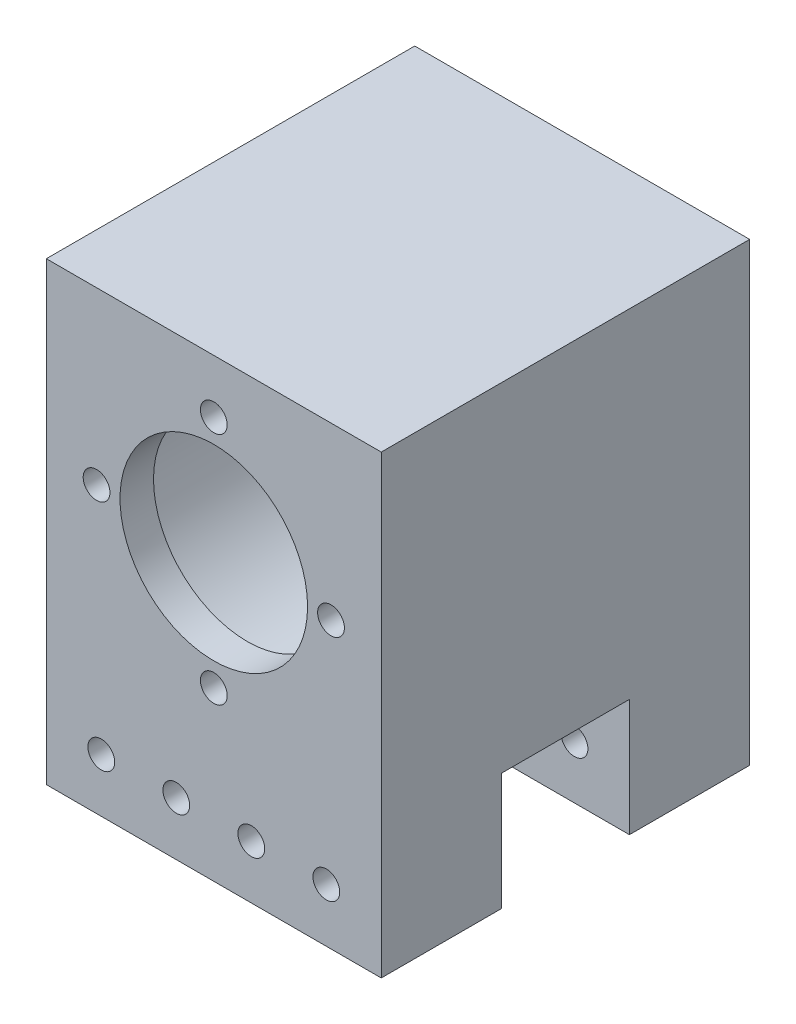
ISO-10303-21;
HEADER;
FILE_DESCRIPTION(('STEP AP214'),'2;1');
FILE_NAME('part.step','',(''),(''),'','','');
FILE_SCHEMA(('AUTOMOTIVE_DESIGN { 1 0 10303 214 1 1 1 1 }'));
ENDSEC;
DATA;
#1=APPLICATION_CONTEXT('core data for automotive mechanical design processes');
#2=APPLICATION_PROTOCOL_DEFINITION('international standard','automotive_design',2000,#1);
#3=PRODUCT_CONTEXT('',#1,'mechanical');
#4=PRODUCT('Part','Part','',(#3));
#5=PRODUCT_RELATED_PRODUCT_CATEGORY('part','',(#4));
#6=PRODUCT_DEFINITION_FORMATION('','',#4);
#7=PRODUCT_DEFINITION_CONTEXT('part definition',#1,'design');
#8=PRODUCT_DEFINITION('design','',#6,#7);
#9=PRODUCT_DEFINITION_SHAPE('','',#8);
#10=(LENGTH_UNIT() NAMED_UNIT(*) SI_UNIT(.MILLI.,.METRE.));
#11=(NAMED_UNIT(*) PLANE_ANGLE_UNIT() SI_UNIT($,.RADIAN.));
#12=(NAMED_UNIT(*) SI_UNIT($,.STERADIAN.) SOLID_ANGLE_UNIT());
#13=UNCERTAINTY_MEASURE_WITH_UNIT(LENGTH_MEASURE(1.E-05),#10,'distance_accuracy_value','');
#14=(GEOMETRIC_REPRESENTATION_CONTEXT(3) GLOBAL_UNCERTAINTY_ASSIGNED_CONTEXT((#13)) GLOBAL_UNIT_ASSIGNED_CONTEXT((#10,
#11,#12)) REPRESENTATION_CONTEXT('',''));
#15=CARTESIAN_POINT('',(0.,0.,0.));
#16=DIRECTION('',(0.,0.,1.));
#17=DIRECTION('',(1.,0.,0.));
#18=AXIS2_PLACEMENT_3D('',#15,#16,#17);
#19=CARTESIAN_POINT('',(0.,0.,0.));
#20=DIRECTION('',(0.,-1.,0.));
#21=DIRECTION('',(0.,0.,-1.));
#22=AXIS2_PLACEMENT_3D('',#19,#20,#21);
#23=PLANE('',#22);
#24=DIRECTION('',(1.,0.,0.));
#25=VECTOR('',#24,1.);
#26=CARTESIAN_POINT('',(-25.,0.,9.55));
#27=LINE('',#26,#25);
#28=CARTESIAN_POINT('',(-25.,0.,9.55));
#29=VERTEX_POINT('',#28);
#30=CARTESIAN_POINT('',(25.,0.,9.55));
#31=VERTEX_POINT('',#30);
#32=EDGE_CURVE('E124',#29,#31,#27,.T.);
#33=ORIENTED_EDGE('',*,*,#32,.T.);
#34=DIRECTION('',(0.,0.,-1.));
#35=VECTOR('',#34,1.);
#36=CARTESIAN_POINT('',(25.,0.,27.5));
#37=LINE('',#36,#35);
#38=CARTESIAN_POINT('',(25.,0.,27.5));
#39=VERTEX_POINT('',#38);
#40=EDGE_CURVE('E156',#39,#31,#37,.T.);
#41=ORIENTED_EDGE('',*,*,#40,.F.);
#42=DIRECTION('',(1.,0.,0.));
#43=VECTOR('',#42,1.);
#44=CARTESIAN_POINT('',(-25.,0.,27.5));
#45=LINE('',#44,#43);
#46=CARTESIAN_POINT('',(-25.,0.,27.5));
#47=VERTEX_POINT('',#46);
#48=EDGE_CURVE('E95',#47,#39,#45,.T.);
#49=ORIENTED_EDGE('',*,*,#48,.F.);
#50=DIRECTION('',(0.,0.,1.));
#51=VECTOR('',#50,1.);
#52=CARTESIAN_POINT('',(-25.,0.,27.5));
#53=LINE('',#52,#51);
#54=EDGE_CURVE('E142',#29,#47,#53,.T.);
#55=ORIENTED_EDGE('',*,*,#54,.F.);
#56=EDGE_LOOP('',(#33,#41,#49,#55));
#57=FACE_BOUND('',#56,.T.);
#58=ADVANCED_FACE('F47',(#57),#23,.T.);
#59=CARTESIAN_POINT('',(25.,68.,27.5));
#60=DIRECTION('',(-1.,0.,0.));
#61=DIRECTION('',(0.,0.,1.));
#62=AXIS2_PLACEMENT_3D('',#59,#60,#61);
#63=PLANE('',#62);
#64=ORIENTED_EDGE('',*,*,#40,.T.);
#65=DIRECTION('',(0.,-1.,0.));
#66=VECTOR('',#65,1.);
#67=CARTESIAN_POINT('',(25.,0.,9.55));
#68=LINE('',#67,#66);
#69=CARTESIAN_POINT('',(25.,17.5,9.55));
#70=VERTEX_POINT('',#69);
#71=EDGE_CURVE('E130',#70,#31,#68,.T.);
#72=ORIENTED_EDGE('',*,*,#71,.F.);
#73=DIRECTION('',(0.,0.,1.));
#74=VECTOR('',#73,1.);
#75=CARTESIAN_POINT('',(25.,17.5,9.55));
#76=LINE('',#75,#74);
#77=CARTESIAN_POINT('',(25.,17.5,-9.55));
#78=VERTEX_POINT('',#77);
#79=EDGE_CURVE('E145',#78,#70,#76,.T.);
#80=ORIENTED_EDGE('',*,*,#79,.F.);
#81=DIRECTION('',(0.,1.,0.));
#82=VECTOR('',#81,1.);
#83=CARTESIAN_POINT('',(25.,0.,-9.55));
#84=LINE('',#83,#82);
#85=CARTESIAN_POINT('',(25.,0.,-9.55));
#86=VERTEX_POINT('',#85);
#87=EDGE_CURVE('E235',#86,#78,#84,.T.);
#88=ORIENTED_EDGE('',*,*,#87,.F.);
#89=CARTESIAN_POINT('',(25.,0.,-27.5));
#90=VERTEX_POINT('',#89);
#91=EDGE_CURVE('E276',#86,#90,#37,.T.);
#92=ORIENTED_EDGE('',*,*,#91,.T.);
#93=DIRECTION('',(0.,-1.,0.));
#94=VECTOR('',#93,1.);
#95=CARTESIAN_POINT('',(25.,68.,-27.5));
#96=LINE('',#95,#94);
#97=CARTESIAN_POINT('',(25.,68.,-27.5));
#98=VERTEX_POINT('',#97);
#99=EDGE_CURVE('E12',#98,#90,#96,.T.);
#100=ORIENTED_EDGE('',*,*,#99,.F.);
#101=DIRECTION('',(0.,0.,-1.));
#102=VECTOR('',#101,1.);
#103=CARTESIAN_POINT('',(25.,68.,27.5));
#104=LINE('',#103,#102);
#105=CARTESIAN_POINT('',(25.,68.,27.5));
#106=VERTEX_POINT('',#105);
#107=EDGE_CURVE('E162',#106,#98,#104,.T.);
#108=ORIENTED_EDGE('',*,*,#107,.F.);
#109=DIRECTION('',(0.,-1.,0.));
#110=VECTOR('',#109,1.);
#111=CARTESIAN_POINT('',(25.,68.,27.5));
#112=LINE('',#111,#110);
#113=EDGE_CURVE('E163',#106,#39,#112,.T.);
#114=ORIENTED_EDGE('',*,*,#113,.T.);
#115=EDGE_LOOP('',(#64,#72,#80,#88,#92,#100,#108,#114));
#116=FACE_BOUND('',#115,.T.);
#117=ADVANCED_FACE('F49',(#116),#63,.F.);
#118=CARTESIAN_POINT('',(-25.,68.,-27.5));
#119=DIRECTION('',(0.,0.,1.));
#120=DIRECTION('',(1.,0.,0.));
#121=AXIS2_PLACEMENT_3D('',#118,#119,#120);
#122=PLANE('',#121);
#123=CARTESIAN_POINT('',(-16.8,8.,-27.5));
#124=DIRECTION('',(0.,0.,1.));
#125=DIRECTION('',(1.,0.,0.));
#126=AXIS2_PLACEMENT_3D('',#123,#124,#125);
#127=CIRCLE('',#126,2.);
#128=CARTESIAN_POINT('',(-14.8,8.,-27.5));
#129=VERTEX_POINT('',#128);
#130=EDGE_CURVE('E199',#129,#129,#127,.T.);
#131=ORIENTED_EDGE('',*,*,#130,.T.);
#132=EDGE_LOOP('',(#131));
#133=FACE_BOUND('',#132,.T.);
#134=CARTESIAN_POINT('',(-5.6,8.,-27.5));
#135=DIRECTION('',(0.,0.,1.));
#136=DIRECTION('',(1.,0.,0.));
#137=AXIS2_PLACEMENT_3D('',#134,#135,#136);
#138=CIRCLE('',#137,2.);
#139=CARTESIAN_POINT('',(-3.59999999999999,8.,-27.5));
#140=VERTEX_POINT('',#139);
#141=EDGE_CURVE('E423',#140,#140,#138,.T.);
#142=ORIENTED_EDGE('',*,*,#141,.T.);
#143=EDGE_LOOP('',(#142));
#144=FACE_BOUND('',#143,.T.);
#145=CARTESIAN_POINT('',(5.6,8.,-27.5));
#146=DIRECTION('',(0.,0.,1.));
#147=DIRECTION('',(1.,0.,0.));
#148=AXIS2_PLACEMENT_3D('',#145,#146,#147);
#149=CIRCLE('',#148,2.);
#150=CARTESIAN_POINT('',(7.6,8.,-27.5));
#151=VERTEX_POINT('',#150);
#152=EDGE_CURVE('E435',#151,#151,#149,.T.);
#153=ORIENTED_EDGE('',*,*,#152,.T.);
#154=EDGE_LOOP('',(#153));
#155=FACE_BOUND('',#154,.T.);
#156=CARTESIAN_POINT('',(16.8,8.,-27.5));
#157=DIRECTION('',(0.,0.,1.));
#158=DIRECTION('',(1.,0.,0.));
#159=AXIS2_PLACEMENT_3D('',#156,#157,#158);
#160=CIRCLE('',#159,2.);
#161=CARTESIAN_POINT('',(18.8,8.,-27.5));
#162=VERTEX_POINT('',#161);
#163=EDGE_CURVE('E447',#162,#162,#160,.T.);
#164=ORIENTED_EDGE('',*,*,#163,.T.);
#165=EDGE_LOOP('',(#164));
#166=FACE_BOUND('',#165,.T.);
#167=CARTESIAN_POINT('',(0.,42.5,-27.5));
#168=DIRECTION('',(0.,0.,-1.));
#169=DIRECTION('',(-1.,0.,0.));
#170=AXIS2_PLACEMENT_3D('',#167,#168,#169);
#171=CIRCLE('',#170,21.125);
#172=CARTESIAN_POINT('',(-21.125,42.5,-27.5));
#173=VERTEX_POINT('',#172);
#174=EDGE_CURVE('E193',#173,#173,#171,.T.);
#175=ORIENTED_EDGE('',*,*,#174,.F.);
#176=EDGE_LOOP('',(#175));
#177=FACE_BOUND('',#176,.T.);
#178=DIRECTION('',(-1.,0.,0.));
#179=VECTOR('',#178,1.);
#180=CARTESIAN_POINT('',(-25.,0.,-27.5));
#181=LINE('',#180,#179);
#182=CARTESIAN_POINT('',(-25.,0.,-27.5));
#183=VERTEX_POINT('',#182);
#184=EDGE_CURVE('E149',#90,#183,#181,.T.);
#185=ORIENTED_EDGE('',*,*,#184,.T.);
#186=DIRECTION('',(0.,-1.,0.));
#187=VECTOR('',#186,1.);
#188=CARTESIAN_POINT('',(-25.,68.,-27.5));
#189=LINE('',#188,#187);
#190=CARTESIAN_POINT('',(-25.,68.,-27.5));
#191=VERTEX_POINT('',#190);
#192=EDGE_CURVE('E57',#191,#183,#189,.T.);
#193=ORIENTED_EDGE('',*,*,#192,.F.);
#194=DIRECTION('',(-1.,0.,0.));
#195=VECTOR('',#194,1.);
#196=CARTESIAN_POINT('',(-25.,68.,-27.5));
#197=LINE('',#196,#195);
#198=EDGE_CURVE('E102',#98,#191,#197,.T.);
#199=ORIENTED_EDGE('',*,*,#198,.F.);
#200=ORIENTED_EDGE('',*,*,#99,.T.);
#201=EDGE_LOOP('',(#185,#193,#199,#200));
#202=FACE_BOUND('',#201,.T.);
#203=ADVANCED_FACE('F301',(#133,#144,#155,#166,#177,#202),#122,.F.);
#204=CARTESIAN_POINT('',(-25.,68.,27.5));
#205=DIRECTION('',(1.,0.,0.));
#206=DIRECTION('',(0.,0.,-1.));
#207=AXIS2_PLACEMENT_3D('',#204,#205,#206);
#208=PLANE('',#207);
#209=DIRECTION('',(0.,0.,1.));
#210=VECTOR('',#209,1.);
#211=CARTESIAN_POINT('',(-25.,17.5,9.55));
#212=LINE('',#211,#210);
#213=CARTESIAN_POINT('',(-25.,17.5,-9.55));
#214=VERTEX_POINT('',#213);
#215=CARTESIAN_POINT('',(-25.,17.5,9.55));
#216=VERTEX_POINT('',#215);
#217=EDGE_CURVE('E137',#214,#216,#212,.T.);
#218=ORIENTED_EDGE('',*,*,#217,.T.);
#219=DIRECTION('',(0.,-1.,0.));
#220=VECTOR('',#219,1.);
#221=CARTESIAN_POINT('',(-25.,0.,9.55));
#222=LINE('',#221,#220);
#223=EDGE_CURVE('E127',#216,#29,#222,.T.);
#224=ORIENTED_EDGE('',*,*,#223,.T.);
#225=ORIENTED_EDGE('',*,*,#54,.T.);
#226=DIRECTION('',(0.,-1.,0.));
#227=VECTOR('',#226,1.);
#228=CARTESIAN_POINT('',(-25.,68.,27.5));
#229=LINE('',#228,#227);
#230=CARTESIAN_POINT('',(-25.,68.,27.5));
#231=VERTEX_POINT('',#230);
#232=EDGE_CURVE('E166',#231,#47,#229,.T.);
#233=ORIENTED_EDGE('',*,*,#232,.F.);
#234=DIRECTION('',(0.,0.,1.));
#235=VECTOR('',#234,1.);
#236=CARTESIAN_POINT('',(-25.,68.,27.5));
#237=LINE('',#236,#235);
#238=EDGE_CURVE('E281',#191,#231,#237,.T.);
#239=ORIENTED_EDGE('',*,*,#238,.F.);
#240=ORIENTED_EDGE('',*,*,#192,.T.);
#241=CARTESIAN_POINT('',(-25.,0.,-9.55));
#242=VERTEX_POINT('',#241);
#243=EDGE_CURVE('E148',#183,#242,#53,.T.);
#244=ORIENTED_EDGE('',*,*,#243,.T.);
#245=DIRECTION('',(0.,1.,0.));
#246=VECTOR('',#245,1.);
#247=CARTESIAN_POINT('',(-25.,0.,-9.55));
#248=LINE('',#247,#246);
#249=EDGE_CURVE('E65',#242,#214,#248,.T.);
#250=ORIENTED_EDGE('',*,*,#249,.T.);
#251=EDGE_LOOP('',(#218,#224,#225,#233,#239,#240,#244,#250));
#252=FACE_BOUND('',#251,.T.);
#253=ADVANCED_FACE('F140',(#252),#208,.F.);
#254=CARTESIAN_POINT('',(-25.,68.,27.5));
#255=DIRECTION('',(0.,0.,-1.));
#256=DIRECTION('',(-1.,0.,0.));
#257=AXIS2_PLACEMENT_3D('',#254,#255,#256);
#258=PLANE('',#257);
#259=CARTESIAN_POINT('',(-16.8,8.,27.5));
#260=DIRECTION('',(0.,0.,1.));
#261=DIRECTION('',(1.,0.,0.));
#262=AXIS2_PLACEMENT_3D('',#259,#260,#261);
#263=CIRCLE('',#262,2.);
#264=CARTESIAN_POINT('',(-14.8,8.,27.5));
#265=VERTEX_POINT('',#264);
#266=EDGE_CURVE('E418',#265,#265,#263,.T.);
#267=ORIENTED_EDGE('',*,*,#266,.F.);
#268=EDGE_LOOP('',(#267));
#269=FACE_BOUND('',#268,.T.);
#270=CARTESIAN_POINT('',(-5.6,8.,27.5));
#271=DIRECTION('',(0.,0.,1.));
#272=DIRECTION('',(1.,0.,0.));
#273=AXIS2_PLACEMENT_3D('',#270,#271,#272);
#274=CIRCLE('',#273,2.);
#275=CARTESIAN_POINT('',(-3.59999999999999,8.,27.5));
#276=VERTEX_POINT('',#275);
#277=EDGE_CURVE('E429',#276,#276,#274,.T.);
#278=ORIENTED_EDGE('',*,*,#277,.F.);
#279=EDGE_LOOP('',(#278));
#280=FACE_BOUND('',#279,.T.);
#281=CARTESIAN_POINT('',(5.6,8.,27.5));
#282=DIRECTION('',(0.,0.,1.));
#283=DIRECTION('',(1.,0.,0.));
#284=AXIS2_PLACEMENT_3D('',#281,#282,#283);
#285=CIRCLE('',#284,2.);
#286=CARTESIAN_POINT('',(7.6,8.,27.5));
#287=VERTEX_POINT('',#286);
#288=EDGE_CURVE('E441',#287,#287,#285,.T.);
#289=ORIENTED_EDGE('',*,*,#288,.F.);
#290=EDGE_LOOP('',(#289));
#291=FACE_BOUND('',#290,.T.);
#292=CARTESIAN_POINT('',(16.8,8.,27.5));
#293=DIRECTION('',(0.,0.,1.));
#294=DIRECTION('',(1.,0.,0.));
#295=AXIS2_PLACEMENT_3D('',#292,#293,#294);
#296=CIRCLE('',#295,2.);
#297=CARTESIAN_POINT('',(18.8,8.,27.5));
#298=VERTEX_POINT('',#297);
#299=EDGE_CURVE('E453',#298,#298,#296,.T.);
#300=ORIENTED_EDGE('',*,*,#299,.F.);
#301=EDGE_LOOP('',(#300));
#302=FACE_BOUND('',#301,.T.);
#303=CARTESIAN_POINT('',(0.,60.,27.5));
#304=DIRECTION('',(0.,0.,1.));
#305=DIRECTION('',(1.,0.,0.));
#306=AXIS2_PLACEMENT_3D('',#303,#304,#305);
#307=CIRCLE('',#306,2.00000000000001);
#308=CARTESIAN_POINT('',(2.00000000000001,60.,27.5));
#309=VERTEX_POINT('',#308);
#310=EDGE_CURVE('E259',#309,#309,#307,.T.);
#311=ORIENTED_EDGE('',*,*,#310,.F.);
#312=EDGE_LOOP('',(#311));
#313=FACE_BOUND('',#312,.T.);
#314=CARTESIAN_POINT('',(17.5,42.5,27.5));
#315=DIRECTION('',(0.,0.,1.));
#316=DIRECTION('',(1.,0.,0.));
#317=AXIS2_PLACEMENT_3D('',#314,#315,#316);
#318=CIRCLE('',#317,2.00000000000001);
#319=CARTESIAN_POINT('',(19.5,42.5,27.5));
#320=VERTEX_POINT('',#319);
#321=EDGE_CURVE('E255',#320,#320,#318,.T.);
#322=ORIENTED_EDGE('',*,*,#321,.F.);
#323=EDGE_LOOP('',(#322));
#324=FACE_BOUND('',#323,.T.);
#325=CARTESIAN_POINT('',(0.,25.,27.5));
#326=DIRECTION('',(0.,0.,1.));
#327=DIRECTION('',(1.,0.,0.));
#328=AXIS2_PLACEMENT_3D('',#325,#326,#327);
#329=CIRCLE('',#328,2.00000000000001);
#330=CARTESIAN_POINT('',(2.00000000000001,25.,27.5));
#331=VERTEX_POINT('',#330);
#332=EDGE_CURVE('E251',#331,#331,#329,.T.);
#333=ORIENTED_EDGE('',*,*,#332,.F.);
#334=EDGE_LOOP('',(#333));
#335=FACE_BOUND('',#334,.T.);
#336=CARTESIAN_POINT('',(-17.5,42.5,27.5));
#337=DIRECTION('',(0.,0.,1.));
#338=DIRECTION('',(1.,0.,0.));
#339=AXIS2_PLACEMENT_3D('',#336,#337,#338);
#340=CIRCLE('',#339,2.00000000000001);
#341=CARTESIAN_POINT('',(-15.5,42.5,27.5));
#342=VERTEX_POINT('',#341);
#343=EDGE_CURVE('E245',#342,#342,#340,.T.);
#344=ORIENTED_EDGE('',*,*,#343,.F.);
#345=EDGE_LOOP('',(#344));
#346=FACE_BOUND('',#345,.T.);
#347=CARTESIAN_POINT('',(0.,42.5,27.5));
#348=DIRECTION('',(0.,0.,1.));
#349=DIRECTION('',(1.,0.,0.));
#350=AXIS2_PLACEMENT_3D('',#347,#348,#349);
#351=CIRCLE('',#350,14.);
#352=CARTESIAN_POINT('',(14.,42.5,27.5));
#353=VERTEX_POINT('',#352);
#354=EDGE_CURVE('E177',#353,#353,#351,.T.);
#355=ORIENTED_EDGE('',*,*,#354,.F.);
#356=EDGE_LOOP('',(#355));
#357=FACE_BOUND('',#356,.T.);
#358=ORIENTED_EDGE('',*,*,#48,.T.);
#359=ORIENTED_EDGE('',*,*,#113,.F.);
#360=DIRECTION('',(1.,0.,0.));
#361=VECTOR('',#360,1.);
#362=CARTESIAN_POINT('',(-25.,68.,27.5));
#363=LINE('',#362,#361);
#364=EDGE_CURVE('E74',#231,#106,#363,.T.);
#365=ORIENTED_EDGE('',*,*,#364,.F.);
#366=ORIENTED_EDGE('',*,*,#232,.T.);
#367=EDGE_LOOP('',(#358,#359,#365,#366));
#368=FACE_BOUND('',#367,.T.);
#369=ADVANCED_FACE('F308',(#269,#280,#291,#302,#313,#324,#335,#346,#357,#368),#258,.F.);
#370=CARTESIAN_POINT('',(0.,68.,0.));
#371=DIRECTION('',(0.,-1.,0.));
#372=DIRECTION('',(0.,0.,-1.));
#373=AXIS2_PLACEMENT_3D('',#370,#371,#372);
#374=PLANE('',#373);
#375=ORIENTED_EDGE('',*,*,#107,.T.);
#376=ORIENTED_EDGE('',*,*,#198,.T.);
#377=ORIENTED_EDGE('',*,*,#238,.T.);
#378=ORIENTED_EDGE('',*,*,#364,.T.);
#379=EDGE_LOOP('',(#375,#376,#377,#378));
#380=FACE_BOUND('',#379,.T.);
#381=ADVANCED_FACE('F320',(#380),#374,.F.);
#382=DIRECTION('',(1.,0.,0.));
#383=VECTOR('',#382,1.);
#384=CARTESIAN_POINT('',(-25.,0.,-9.55));
#385=LINE('',#384,#383);
#386=EDGE_CURVE('E136',#242,#86,#385,.T.);
#387=ORIENTED_EDGE('',*,*,#386,.F.);
#388=ORIENTED_EDGE('',*,*,#243,.F.);
#389=ORIENTED_EDGE('',*,*,#184,.F.);
#390=ORIENTED_EDGE('',*,*,#91,.F.);
#391=EDGE_LOOP('',(#387,#388,#389,#390));
#392=FACE_BOUND('',#391,.T.);
#393=ADVANCED_FACE('F300',(#392),#23,.T.);
#394=CARTESIAN_POINT('',(0.,42.5,87.2505230102633));
#395=DIRECTION('',(0.,0.,-1.));
#396=DIRECTION('',(-1.,0.,0.));
#397=AXIS2_PLACEMENT_3D('',#394,#395,#396);
#398=CYLINDRICAL_SURFACE('',#397,21.125);
#399=CARTESIAN_POINT('',(0.,42.5,22.5));
#400=DIRECTION('',(0.,0.,-1.));
#401=DIRECTION('',(-1.,0.,0.));
#402=AXIS2_PLACEMENT_3D('',#399,#400,#401);
#403=CIRCLE('',#402,21.125);
#404=CARTESIAN_POINT('',(-21.125,42.5,22.5));
#405=VERTEX_POINT('',#404);
#406=EDGE_CURVE('E272',#405,#405,#403,.F.);
#407=ORIENTED_EDGE('',*,*,#406,.T.);
#408=EDGE_LOOP('',(#407));
#409=FACE_BOUND('',#408,.T.);
#410=ORIENTED_EDGE('',*,*,#174,.T.);
#411=EDGE_LOOP('',(#410));
#412=FACE_BOUND('',#411,.T.);
#413=ADVANCED_FACE('F319',(#409,#412),#398,.F.);
#414=CARTESIAN_POINT('',(-25.,68.,22.5));
#415=DIRECTION('',(0.,0.,-1.));
#416=DIRECTION('',(-1.,0.,0.));
#417=AXIS2_PLACEMENT_3D('',#414,#415,#416);
#418=PLANE('',#417);
#419=CARTESIAN_POINT('',(0.,60.,22.5));
#420=DIRECTION('',(0.,0.,-1.));
#421=DIRECTION('',(-1.,0.,0.));
#422=AXIS2_PLACEMENT_3D('',#419,#420,#421);
#423=CIRCLE('',#422,2.00000000000001);
#424=CARTESIAN_POINT('',(-2.00000000000001,60.,22.5));
#425=VERTEX_POINT('',#424);
#426=EDGE_CURVE('E189',#425,#425,#423,.T.);
#427=ORIENTED_EDGE('',*,*,#426,.F.);
#428=EDGE_LOOP('',(#427));
#429=FACE_BOUND('',#428,.T.);
#430=CARTESIAN_POINT('',(17.5,42.5,22.5));
#431=DIRECTION('',(0.,0.,-1.));
#432=DIRECTION('',(-1.,0.,0.));
#433=AXIS2_PLACEMENT_3D('',#430,#431,#432);
#434=CIRCLE('',#433,2.00000000000001);
#435=CARTESIAN_POINT('',(15.5,42.5,22.5));
#436=VERTEX_POINT('',#435);
#437=EDGE_CURVE('E185',#436,#436,#434,.T.);
#438=ORIENTED_EDGE('',*,*,#437,.F.);
#439=EDGE_LOOP('',(#438));
#440=FACE_BOUND('',#439,.T.);
#441=CARTESIAN_POINT('',(0.,25.,22.5));
#442=DIRECTION('',(0.,0.,-1.));
#443=DIRECTION('',(-1.,0.,0.));
#444=AXIS2_PLACEMENT_3D('',#441,#442,#443);
#445=CIRCLE('',#444,2.00000000000001);
#446=CARTESIAN_POINT('',(-2.,25.,22.5));
#447=VERTEX_POINT('',#446);
#448=EDGE_CURVE('E181',#447,#447,#445,.T.);
#449=ORIENTED_EDGE('',*,*,#448,.F.);
#450=EDGE_LOOP('',(#449));
#451=FACE_BOUND('',#450,.T.);
#452=CARTESIAN_POINT('',(-17.5,42.5,22.5));
#453=DIRECTION('',(0.,0.,-1.));
#454=DIRECTION('',(-1.,0.,0.));
#455=AXIS2_PLACEMENT_3D('',#452,#453,#454);
#456=CIRCLE('',#455,2.00000000000001);
#457=CARTESIAN_POINT('',(-19.5,42.5,22.5));
#458=VERTEX_POINT('',#457);
#459=EDGE_CURVE('E176',#458,#458,#456,.T.);
#460=ORIENTED_EDGE('',*,*,#459,.F.);
#461=EDGE_LOOP('',(#460));
#462=FACE_BOUND('',#461,.T.);
#463=CARTESIAN_POINT('',(0.,42.5,22.5));
#464=DIRECTION('',(0.,0.,-1.));
#465=DIRECTION('',(-1.,0.,0.));
#466=AXIS2_PLACEMENT_3D('',#463,#464,#465);
#467=CIRCLE('',#466,14.);
#468=CARTESIAN_POINT('',(-14.,42.5,22.5));
#469=VERTEX_POINT('',#468);
#470=EDGE_CURVE('E172',#469,#469,#467,.T.);
#471=ORIENTED_EDGE('',*,*,#470,.F.);
#472=EDGE_LOOP('',(#471));
#473=FACE_BOUND('',#472,.T.);
#474=ORIENTED_EDGE('',*,*,#406,.F.);
#475=EDGE_LOOP('',(#474));
#476=FACE_BOUND('',#475,.T.);
#477=ADVANCED_FACE('F325',(#429,#440,#451,#462,#473,#476),#418,.T.);
#478=CARTESIAN_POINT('',(0.,42.5,-27.5));
#479=DIRECTION('',(0.,0.,1.));
#480=DIRECTION('',(1.,0.,0.));
#481=AXIS2_PLACEMENT_3D('',#478,#479,#480);
#482=CYLINDRICAL_SURFACE('',#481,14.);
#483=ORIENTED_EDGE('',*,*,#470,.T.);
#484=EDGE_LOOP('',(#483));
#485=FACE_BOUND('',#484,.T.);
#486=ORIENTED_EDGE('',*,*,#354,.T.);
#487=EDGE_LOOP('',(#486));
#488=FACE_BOUND('',#487,.T.);
#489=ADVANCED_FACE('F335',(#485,#488),#482,.F.);
#490=CARTESIAN_POINT('',(-17.5,42.5,-27.5));
#491=DIRECTION('',(0.,0.,1.));
#492=DIRECTION('',(1.,0.,0.));
#493=AXIS2_PLACEMENT_3D('',#490,#491,#492);
#494=CYLINDRICAL_SURFACE('',#493,2.00000000000001);
#495=ORIENTED_EDGE('',*,*,#459,.T.);
#496=EDGE_LOOP('',(#495));
#497=FACE_BOUND('',#496,.T.);
#498=ORIENTED_EDGE('',*,*,#343,.T.);
#499=EDGE_LOOP('',(#498));
#500=FACE_BOUND('',#499,.T.);
#501=ADVANCED_FACE('F339',(#497,#500),#494,.F.);
#502=CARTESIAN_POINT('',(0.,25.,-27.5));
#503=DIRECTION('',(0.,0.,1.));
#504=DIRECTION('',(1.,0.,0.));
#505=AXIS2_PLACEMENT_3D('',#502,#503,#504);
#506=CYLINDRICAL_SURFACE('',#505,2.00000000000001);
#507=ORIENTED_EDGE('',*,*,#448,.T.);
#508=EDGE_LOOP('',(#507));
#509=FACE_BOUND('',#508,.T.);
#510=ORIENTED_EDGE('',*,*,#332,.T.);
#511=EDGE_LOOP('',(#510));
#512=FACE_BOUND('',#511,.T.);
#513=ADVANCED_FACE('F345',(#509,#512),#506,.F.);
#514=CARTESIAN_POINT('',(17.5,42.5,-27.5));
#515=DIRECTION('',(0.,0.,1.));
#516=DIRECTION('',(1.,0.,0.));
#517=AXIS2_PLACEMENT_3D('',#514,#515,#516);
#518=CYLINDRICAL_SURFACE('',#517,2.00000000000001);
#519=ORIENTED_EDGE('',*,*,#437,.T.);
#520=EDGE_LOOP('',(#519));
#521=FACE_BOUND('',#520,.T.);
#522=ORIENTED_EDGE('',*,*,#321,.T.);
#523=EDGE_LOOP('',(#522));
#524=FACE_BOUND('',#523,.T.);
#525=ADVANCED_FACE('F341',(#521,#524),#518,.F.);
#526=CARTESIAN_POINT('',(0.,60.,-27.5));
#527=DIRECTION('',(0.,0.,1.));
#528=DIRECTION('',(1.,0.,0.));
#529=AXIS2_PLACEMENT_3D('',#526,#527,#528);
#530=CYLINDRICAL_SURFACE('',#529,2.00000000000001);
#531=ORIENTED_EDGE('',*,*,#426,.T.);
#532=EDGE_LOOP('',(#531));
#533=FACE_BOUND('',#532,.T.);
#534=ORIENTED_EDGE('',*,*,#310,.T.);
#535=EDGE_LOOP('',(#534));
#536=FACE_BOUND('',#535,.T.);
#537=ADVANCED_FACE('F344',(#533,#536),#530,.F.);
#538=CARTESIAN_POINT('',(-25.,0.,9.55));
#539=DIRECTION('',(0.,0.,1.));
#540=DIRECTION('',(0.,-1.,0.));
#541=AXIS2_PLACEMENT_3D('',#538,#539,#540);
#542=PLANE('',#541);
#543=CARTESIAN_POINT('',(-16.8,8.,9.55));
#544=DIRECTION('',(0.,0.,1.));
#545=DIRECTION('',(0.,-1.,0.));
#546=AXIS2_PLACEMENT_3D('',#543,#544,#545);
#547=CIRCLE('',#546,2.);
#548=CARTESIAN_POINT('',(-16.8,6.,9.55));
#549=VERTEX_POINT('',#548);
#550=EDGE_CURVE('E225',#549,#549,#547,.T.);
#551=ORIENTED_EDGE('',*,*,#550,.T.);
#552=EDGE_LOOP('',(#551));
#553=FACE_BOUND('',#552,.T.);
#554=CARTESIAN_POINT('',(-5.6,8.,9.55));
#555=DIRECTION('',(0.,0.,1.));
#556=DIRECTION('',(0.,-1.,0.));
#557=AXIS2_PLACEMENT_3D('',#554,#555,#556);
#558=CIRCLE('',#557,2.);
#559=CARTESIAN_POINT('',(-5.6,6.,9.55));
#560=VERTEX_POINT('',#559);
#561=EDGE_CURVE('E207',#560,#560,#558,.T.);
#562=ORIENTED_EDGE('',*,*,#561,.T.);
#563=EDGE_LOOP('',(#562));
#564=FACE_BOUND('',#563,.T.);
#565=CARTESIAN_POINT('',(5.6,8.,9.55));
#566=DIRECTION('',(0.,0.,1.));
#567=DIRECTION('',(0.,-1.,0.));
#568=AXIS2_PLACEMENT_3D('',#565,#566,#567);
#569=CIRCLE('',#568,2.);
#570=CARTESIAN_POINT('',(5.6,6.,9.55));
#571=VERTEX_POINT('',#570);
#572=EDGE_CURVE('E203',#571,#571,#569,.T.);
#573=ORIENTED_EDGE('',*,*,#572,.T.);
#574=EDGE_LOOP('',(#573));
#575=FACE_BOUND('',#574,.T.);
#576=CARTESIAN_POINT('',(16.8,8.,9.55));
#577=DIRECTION('',(0.,0.,1.));
#578=DIRECTION('',(0.,-1.,0.));
#579=AXIS2_PLACEMENT_3D('',#576,#577,#578);
#580=CIRCLE('',#579,2.);
#581=CARTESIAN_POINT('',(16.8,6.,9.55));
#582=VERTEX_POINT('',#581);
#583=EDGE_CURVE('E198',#582,#582,#580,.T.);
#584=ORIENTED_EDGE('',*,*,#583,.T.);
#585=EDGE_LOOP('',(#584));
#586=FACE_BOUND('',#585,.T.);
#587=ORIENTED_EDGE('',*,*,#71,.T.);
#588=ORIENTED_EDGE('',*,*,#32,.F.);
#589=ORIENTED_EDGE('',*,*,#223,.F.);
#590=DIRECTION('',(1.,0.,0.));
#591=VECTOR('',#590,1.);
#592=CARTESIAN_POINT('',(-25.,17.5,9.55));
#593=LINE('',#592,#591);
#594=EDGE_CURVE('E242',#216,#70,#593,.T.);
#595=ORIENTED_EDGE('',*,*,#594,.T.);
#596=EDGE_LOOP('',(#587,#588,#589,#595));
#597=FACE_BOUND('',#596,.T.);
#598=ADVANCED_FACE('F126',(#553,#564,#575,#586,#597),#542,.F.);
#599=CARTESIAN_POINT('',(-25.,17.5,9.55));
#600=DIRECTION('',(0.,1.,0.));
#601=DIRECTION('',(0.,0.,1.));
#602=AXIS2_PLACEMENT_3D('',#599,#600,#601);
#603=PLANE('',#602);
#604=ORIENTED_EDGE('',*,*,#79,.T.);
#605=ORIENTED_EDGE('',*,*,#594,.F.);
#606=ORIENTED_EDGE('',*,*,#217,.F.);
#607=DIRECTION('',(1.,0.,0.));
#608=VECTOR('',#607,1.);
#609=CARTESIAN_POINT('',(-25.,17.5,-9.55));
#610=LINE('',#609,#608);
#611=EDGE_CURVE('E246',#214,#78,#610,.T.);
#612=ORIENTED_EDGE('',*,*,#611,.T.);
#613=EDGE_LOOP('',(#604,#605,#606,#612));
#614=FACE_BOUND('',#613,.T.);
#615=ADVANCED_FACE('F358',(#614),#603,.F.);
#616=CARTESIAN_POINT('',(-25.,0.,-9.55));
#617=DIRECTION('',(0.,0.,-1.));
#618=DIRECTION('',(-1.,0.,0.));
#619=AXIS2_PLACEMENT_3D('',#616,#617,#618);
#620=PLANE('',#619);
#621=CARTESIAN_POINT('',(-16.8,8.,-9.55));
#622=DIRECTION('',(0.,0.,-1.));
#623=DIRECTION('',(-1.,0.,0.));
#624=AXIS2_PLACEMENT_3D('',#621,#622,#623);
#625=CIRCLE('',#624,2.);
#626=CARTESIAN_POINT('',(-18.8,8.,-9.55));
#627=VERTEX_POINT('',#626);
#628=EDGE_CURVE('E51',#627,#627,#625,.T.);
#629=ORIENTED_EDGE('',*,*,#628,.T.);
#630=EDGE_LOOP('',(#629));
#631=FACE_BOUND('',#630,.T.);
#632=CARTESIAN_POINT('',(-5.6,8.,-9.55));
#633=DIRECTION('',(0.,0.,-1.));
#634=DIRECTION('',(-1.,0.,0.));
#635=AXIS2_PLACEMENT_3D('',#632,#633,#634);
#636=CIRCLE('',#635,2.);
#637=CARTESIAN_POINT('',(-7.6,8.,-9.55));
#638=VERTEX_POINT('',#637);
#639=EDGE_CURVE('E204',#638,#638,#636,.T.);
#640=ORIENTED_EDGE('',*,*,#639,.T.);
#641=EDGE_LOOP('',(#640));
#642=FACE_BOUND('',#641,.T.);
#643=CARTESIAN_POINT('',(5.6,8.,-9.55));
#644=DIRECTION('',(0.,0.,-1.));
#645=DIRECTION('',(-1.,0.,0.));
#646=AXIS2_PLACEMENT_3D('',#643,#644,#645);
#647=CIRCLE('',#646,2.);
#648=CARTESIAN_POINT('',(3.6,8.,-9.55));
#649=VERTEX_POINT('',#648);
#650=EDGE_CURVE('E200',#649,#649,#647,.T.);
#651=ORIENTED_EDGE('',*,*,#650,.T.);
#652=EDGE_LOOP('',(#651));
#653=FACE_BOUND('',#652,.T.);
#654=CARTESIAN_POINT('',(16.8,8.,-9.55));
#655=DIRECTION('',(0.,0.,-1.));
#656=DIRECTION('',(-1.,0.,0.));
#657=AXIS2_PLACEMENT_3D('',#654,#655,#656);
#658=CIRCLE('',#657,2.);
#659=CARTESIAN_POINT('',(14.8,8.,-9.55));
#660=VERTEX_POINT('',#659);
#661=EDGE_CURVE('E194',#660,#660,#658,.T.);
#662=ORIENTED_EDGE('',*,*,#661,.T.);
#663=EDGE_LOOP('',(#662));
#664=FACE_BOUND('',#663,.T.);
#665=ORIENTED_EDGE('',*,*,#87,.T.);
#666=ORIENTED_EDGE('',*,*,#611,.F.);
#667=ORIENTED_EDGE('',*,*,#249,.F.);
#668=ORIENTED_EDGE('',*,*,#386,.T.);
#669=EDGE_LOOP('',(#665,#666,#667,#668));
#670=FACE_BOUND('',#669,.T.);
#671=ADVANCED_FACE('F360',(#631,#642,#653,#664,#670),#620,.F.);
#672=CARTESIAN_POINT('',(16.8,8.,-27.5));
#673=DIRECTION('',(0.,0.,1.));
#674=DIRECTION('',(1.,0.,0.));
#675=AXIS2_PLACEMENT_3D('',#672,#673,#674);
#676=CYLINDRICAL_SURFACE('',#675,2.);
#677=ORIENTED_EDGE('',*,*,#163,.F.);
#678=EDGE_LOOP('',(#677));
#679=FACE_BOUND('',#678,.T.);
#680=ORIENTED_EDGE('',*,*,#661,.F.);
#681=EDGE_LOOP('',(#680));
#682=FACE_BOUND('',#681,.T.);
#683=ADVANCED_FACE('F363',(#679,#682),#676,.F.);
#684=CARTESIAN_POINT('',(5.6,8.,-27.5));
#685=DIRECTION('',(0.,0.,1.));
#686=DIRECTION('',(1.,0.,0.));
#687=AXIS2_PLACEMENT_3D('',#684,#685,#686);
#688=CYLINDRICAL_SURFACE('',#687,2.);
#689=ORIENTED_EDGE('',*,*,#152,.F.);
#690=EDGE_LOOP('',(#689));
#691=FACE_BOUND('',#690,.T.);
#692=ORIENTED_EDGE('',*,*,#650,.F.);
#693=EDGE_LOOP('',(#692));
#694=FACE_BOUND('',#693,.T.);
#695=ADVANCED_FACE('F378',(#691,#694),#688,.F.);
#696=CARTESIAN_POINT('',(-5.6,8.,-27.5));
#697=DIRECTION('',(0.,0.,1.));
#698=DIRECTION('',(1.,0.,0.));
#699=AXIS2_PLACEMENT_3D('',#696,#697,#698);
#700=CYLINDRICAL_SURFACE('',#699,2.);
#701=ORIENTED_EDGE('',*,*,#141,.F.);
#702=EDGE_LOOP('',(#701));
#703=FACE_BOUND('',#702,.T.);
#704=ORIENTED_EDGE('',*,*,#639,.F.);
#705=EDGE_LOOP('',(#704));
#706=FACE_BOUND('',#705,.T.);
#707=ADVANCED_FACE('F383',(#703,#706),#700,.F.);
#708=CARTESIAN_POINT('',(-16.8,8.,-27.5));
#709=DIRECTION('',(0.,0.,1.));
#710=DIRECTION('',(1.,0.,0.));
#711=AXIS2_PLACEMENT_3D('',#708,#709,#710);
#712=CYLINDRICAL_SURFACE('',#711,2.);
#713=ORIENTED_EDGE('',*,*,#130,.F.);
#714=EDGE_LOOP('',(#713));
#715=FACE_BOUND('',#714,.T.);
#716=ORIENTED_EDGE('',*,*,#628,.F.);
#717=EDGE_LOOP('',(#716));
#718=FACE_BOUND('',#717,.T.);
#719=ADVANCED_FACE('F372',(#715,#718),#712,.F.);
#720=ORIENTED_EDGE('',*,*,#299,.T.);
#721=EDGE_LOOP('',(#720));
#722=FACE_BOUND('',#721,.T.);
#723=ORIENTED_EDGE('',*,*,#583,.F.);
#724=EDGE_LOOP('',(#723));
#725=FACE_BOUND('',#724,.T.);
#726=ADVANCED_FACE('F368',(#722,#725),#676,.F.);
#727=ORIENTED_EDGE('',*,*,#288,.T.);
#728=EDGE_LOOP('',(#727));
#729=FACE_BOUND('',#728,.T.);
#730=ORIENTED_EDGE('',*,*,#572,.F.);
#731=EDGE_LOOP('',(#730));
#732=FACE_BOUND('',#731,.T.);
#733=ADVANCED_FACE('F371',(#729,#732),#688,.F.);
#734=ORIENTED_EDGE('',*,*,#277,.T.);
#735=EDGE_LOOP('',(#734));
#736=FACE_BOUND('',#735,.T.);
#737=ORIENTED_EDGE('',*,*,#561,.F.);
#738=EDGE_LOOP('',(#737));
#739=FACE_BOUND('',#738,.T.);
#740=ADVANCED_FACE('F376',(#736,#739),#700,.F.);
#741=ORIENTED_EDGE('',*,*,#266,.T.);
#742=EDGE_LOOP('',(#741));
#743=FACE_BOUND('',#742,.T.);
#744=ORIENTED_EDGE('',*,*,#550,.F.);
#745=EDGE_LOOP('',(#744));
#746=FACE_BOUND('',#745,.T.);
#747=ADVANCED_FACE('F381',(#743,#746),#712,.F.);
#748=CLOSED_SHELL('',(#58,#117,#203,#253,#369,#381,#393,#413,#477,#489,#501,#513,#525,#537,#598,
#615,#671,#683,#695,#707,#719,#726,#733,#740,#747));
#749=MANIFOLD_SOLID_BREP('B2',#748);
#750=ADVANCED_BREP_SHAPE_REPRESENTATION('',(#18,#749),#14);
#751=SHAPE_DEFINITION_REPRESENTATION(#9,#750);
ENDSEC;
END-ISO-10303-21;
